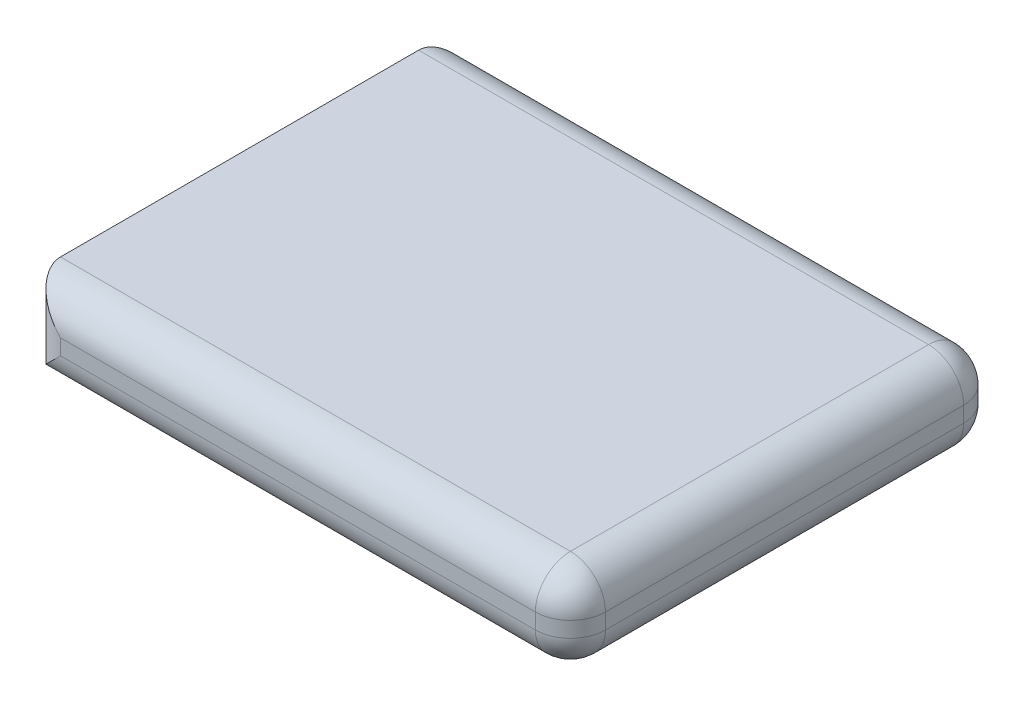
ISO-10303-21;
HEADER;
FILE_DESCRIPTION(('STEP AP214'),'2;1');
FILE_NAME('part.step','',(''),(''),'','','');
FILE_SCHEMA(('AUTOMOTIVE_DESIGN { 1 0 10303 214 1 1 1 1 }'));
ENDSEC;
DATA;
#1=APPLICATION_CONTEXT('core data for automotive mechanical design processes');
#2=APPLICATION_PROTOCOL_DEFINITION('international standard','automotive_design',2000,#1);
#3=PRODUCT_CONTEXT('',#1,'mechanical');
#4=PRODUCT('Part','Part','',(#3));
#5=PRODUCT_RELATED_PRODUCT_CATEGORY('part','',(#4));
#6=PRODUCT_DEFINITION_FORMATION('','',#4);
#7=PRODUCT_DEFINITION_CONTEXT('part definition',#1,'design');
#8=PRODUCT_DEFINITION('design','',#6,#7);
#9=PRODUCT_DEFINITION_SHAPE('','',#8);
#10=(LENGTH_UNIT() NAMED_UNIT(*) SI_UNIT(.MILLI.,.METRE.));
#11=(NAMED_UNIT(*) PLANE_ANGLE_UNIT() SI_UNIT($,.RADIAN.));
#12=(NAMED_UNIT(*) SI_UNIT($,.STERADIAN.) SOLID_ANGLE_UNIT());
#13=UNCERTAINTY_MEASURE_WITH_UNIT(LENGTH_MEASURE(1.E-05),#10,'distance_accuracy_value','');
#14=(GEOMETRIC_REPRESENTATION_CONTEXT(3) GLOBAL_UNCERTAINTY_ASSIGNED_CONTEXT((#13)) GLOBAL_UNIT_ASSIGNED_CONTEXT((#10,
#11,#12)) REPRESENTATION_CONTEXT('',''));
#15=CARTESIAN_POINT('',(0.,0.,0.));
#16=DIRECTION('',(0.,0.,1.));
#17=DIRECTION('',(1.,0.,0.));
#18=AXIS2_PLACEMENT_3D('',#15,#16,#17);
#19=CARTESIAN_POINT('',(35.,5.5,27.5));
#20=DIRECTION('',(-1.,0.,0.));
#21=DIRECTION('',(0.,0.,1.));
#22=AXIS2_PLACEMENT_3D('',#19,#20,#21);
#23=PLANE('',#22);
#24=DIRECTION('',(0.,-1.,0.));
#25=VECTOR('',#24,1.);
#26=CARTESIAN_POINT('',(35.,5.5,-23.));
#27=LINE('',#26,#25);
#28=CARTESIAN_POINT('',(35.,-1.,-23.));
#29=VERTEX_POINT('',#28);
#30=CARTESIAN_POINT('',(35.,1.,-23.));
#31=VERTEX_POINT('',#30);
#32=EDGE_CURVE('E168',#29,#31,#27,.F.);
#33=ORIENTED_EDGE('',*,*,#32,.T.);
#34=DIRECTION('',(0.,0.,-1.));
#35=VECTOR('',#34,1.);
#36=CARTESIAN_POINT('',(35.,1.,27.5));
#37=LINE('',#36,#35);
#38=CARTESIAN_POINT('',(35.,1.,23.));
#39=VERTEX_POINT('',#38);
#40=EDGE_CURVE('E170',#31,#39,#37,.F.);
#41=ORIENTED_EDGE('',*,*,#40,.T.);
#42=DIRECTION('',(0.,-1.,0.));
#43=VECTOR('',#42,1.);
#44=CARTESIAN_POINT('',(35.,5.5,23.));
#45=LINE('',#44,#43);
#46=CARTESIAN_POINT('',(35.,-1.,23.));
#47=VERTEX_POINT('',#46);
#48=EDGE_CURVE('E164',#39,#47,#45,.T.);
#49=ORIENTED_EDGE('',*,*,#48,.T.);
#50=DIRECTION('',(0.,0.,-1.));
#51=VECTOR('',#50,1.);
#52=CARTESIAN_POINT('',(35.,-1.,-27.5));
#53=LINE('',#52,#51);
#54=EDGE_CURVE('E166',#47,#29,#53,.T.);
#55=ORIENTED_EDGE('',*,*,#54,.T.);
#56=EDGE_LOOP('',(#33,#41,#49,#55));
#57=FACE_BOUND('',#56,.T.);
#58=ADVANCED_FACE('F33',(#57),#23,.F.);
#59=CARTESIAN_POINT('',(-35.,5.5,-27.5));
#60=DIRECTION('',(0.,0.,1.));
#61=DIRECTION('',(1.,0.,0.));
#62=AXIS2_PLACEMENT_3D('',#59,#60,#61);
#63=PLANE('',#62);
#64=DIRECTION('',(0.,-1.,0.));
#65=VECTOR('',#64,1.);
#66=CARTESIAN_POINT('',(-30.5,5.5,-27.5));
#67=LINE('',#66,#65);
#68=CARTESIAN_POINT('',(-30.5,-1.,-27.5));
#69=VERTEX_POINT('',#68);
#70=CARTESIAN_POINT('',(-30.5,1.,-27.5));
#71=VERTEX_POINT('',#70);
#72=EDGE_CURVE('E155',#69,#71,#67,.F.);
#73=ORIENTED_EDGE('',*,*,#72,.T.);
#74=DIRECTION('',(-1.,0.,0.));
#75=VECTOR('',#74,1.);
#76=CARTESIAN_POINT('',(-35.,1.,-27.5));
#77=LINE('',#76,#75);
#78=CARTESIAN_POINT('',(30.5,1.,-27.5));
#79=VERTEX_POINT('',#78);
#80=EDGE_CURVE('E116',#71,#79,#77,.F.);
#81=ORIENTED_EDGE('',*,*,#80,.T.);
#82=DIRECTION('',(0.,-1.,0.));
#83=VECTOR('',#82,1.);
#84=CARTESIAN_POINT('',(30.5,5.5,-27.5));
#85=LINE('',#84,#83);
#86=CARTESIAN_POINT('',(30.5,-1.,-27.5));
#87=VERTEX_POINT('',#86);
#88=EDGE_CURVE('E141',#79,#87,#85,.T.);
#89=ORIENTED_EDGE('',*,*,#88,.T.);
#90=DIRECTION('',(-1.,0.,0.));
#91=VECTOR('',#90,1.);
#92=CARTESIAN_POINT('',(-35.,-1.,-27.5));
#93=LINE('',#92,#91);
#94=EDGE_CURVE('E153',#87,#69,#93,.T.);
#95=ORIENTED_EDGE('',*,*,#94,.T.);
#96=EDGE_LOOP('',(#73,#81,#89,#95));
#97=FACE_BOUND('',#96,.T.);
#98=ADVANCED_FACE('F231',(#97),#63,.F.);
#99=CARTESIAN_POINT('',(-35.,5.5,27.5));
#100=DIRECTION('',(1.,0.,0.));
#101=DIRECTION('',(0.,0.,-1.));
#102=AXIS2_PLACEMENT_3D('',#99,#100,#101);
#103=PLANE('',#102);
#104=DIRECTION('',(0.,0.,1.));
#105=VECTOR('',#104,1.);
#106=CARTESIAN_POINT('',(-35.,5.5,27.5));
#107=LINE('',#106,#105);
#108=CARTESIAN_POINT('',(-35.,5.5,-23.));
#109=VERTEX_POINT('',#108);
#110=CARTESIAN_POINT('',(-35.,5.5,23.));
#111=VERTEX_POINT('',#110);
#112=EDGE_CURVE('E136',#109,#111,#107,.T.);
#113=ORIENTED_EDGE('',*,*,#112,.F.);
#114=DIRECTION('',(0.,-1.,0.));
#115=VECTOR('',#114,1.);
#116=CARTESIAN_POINT('',(-35.,5.5,-23.));
#117=LINE('',#116,#115);
#118=CARTESIAN_POINT('',(-35.,-5.5,-23.));
#119=VERTEX_POINT('',#118);
#120=EDGE_CURVE('E122',#109,#119,#117,.T.);
#121=ORIENTED_EDGE('',*,*,#120,.T.);
#122=DIRECTION('',(0.,0.,1.));
#123=VECTOR('',#122,1.);
#124=CARTESIAN_POINT('',(-35.,-5.5,27.5));
#125=LINE('',#124,#123);
#126=CARTESIAN_POINT('',(-35.,-5.5,23.));
#127=VERTEX_POINT('',#126);
#128=EDGE_CURVE('E146',#119,#127,#125,.T.);
#129=ORIENTED_EDGE('',*,*,#128,.T.);
#130=DIRECTION('',(0.,-1.,0.));
#131=VECTOR('',#130,1.);
#132=CARTESIAN_POINT('',(-35.,5.5,23.));
#133=LINE('',#132,#131);
#134=EDGE_CURVE('E131',#127,#111,#133,.F.);
#135=ORIENTED_EDGE('',*,*,#134,.T.);
#136=EDGE_LOOP('',(#113,#121,#129,#135));
#137=FACE_BOUND('',#136,.T.);
#138=ADVANCED_FACE('F143',(#137),#103,.F.);
#139=CARTESIAN_POINT('',(-35.,5.5,27.5));
#140=DIRECTION('',(0.,0.,-1.));
#141=DIRECTION('',(-1.,0.,0.));
#142=AXIS2_PLACEMENT_3D('',#139,#140,#141);
#143=PLANE('',#142);
#144=DIRECTION('',(1.,0.,0.));
#145=VECTOR('',#144,1.);
#146=CARTESIAN_POINT('',(-35.,1.,27.5));
#147=LINE('',#146,#145);
#148=CARTESIAN_POINT('',(30.5,1.,27.5));
#149=VERTEX_POINT('',#148);
#150=CARTESIAN_POINT('',(-30.5,1.,27.5));
#151=VERTEX_POINT('',#150);
#152=EDGE_CURVE('E42',#149,#151,#147,.F.);
#153=ORIENTED_EDGE('',*,*,#152,.T.);
#154=DIRECTION('',(0.,-1.,0.));
#155=VECTOR('',#154,1.);
#156=CARTESIAN_POINT('',(-30.5,5.5,27.5));
#157=LINE('',#156,#155);
#158=CARTESIAN_POINT('',(-30.5,-1.,27.5));
#159=VERTEX_POINT('',#158);
#160=EDGE_CURVE('E11',#151,#159,#157,.T.);
#161=ORIENTED_EDGE('',*,*,#160,.T.);
#162=DIRECTION('',(1.,0.,0.));
#163=VECTOR('',#162,1.);
#164=CARTESIAN_POINT('',(35.,-1.,27.5));
#165=LINE('',#164,#163);
#166=CARTESIAN_POINT('',(30.5,-1.,27.5));
#167=VERTEX_POINT('',#166);
#168=EDGE_CURVE('E173',#159,#167,#165,.T.);
#169=ORIENTED_EDGE('',*,*,#168,.T.);
#170=DIRECTION('',(0.,-1.,0.));
#171=VECTOR('',#170,1.);
#172=CARTESIAN_POINT('',(30.5,5.5,27.5));
#173=LINE('',#172,#171);
#174=EDGE_CURVE('E53',#167,#149,#173,.F.);
#175=ORIENTED_EDGE('',*,*,#174,.T.);
#176=EDGE_LOOP('',(#153,#161,#169,#175));
#177=FACE_BOUND('',#176,.T.);
#178=ADVANCED_FACE('F222',(#177),#143,.F.);
#179=CARTESIAN_POINT('',(0.,5.5,0.));
#180=DIRECTION('',(0.,-1.,0.));
#181=DIRECTION('',(0.,0.,-1.));
#182=AXIS2_PLACEMENT_3D('',#179,#180,#181);
#183=PLANE('',#182);
#184=DIRECTION('',(0.,0.,-1.));
#185=VECTOR('',#184,1.);
#186=CARTESIAN_POINT('',(30.5,5.5,0.));
#187=LINE('',#186,#185);
#188=CARTESIAN_POINT('',(30.5,5.5,23.));
#189=VERTEX_POINT('',#188);
#190=CARTESIAN_POINT('',(30.5,5.5,-23.));
#191=VERTEX_POINT('',#190);
#192=EDGE_CURVE('E139',#189,#191,#187,.T.);
#193=ORIENTED_EDGE('',*,*,#192,.T.);
#194=DIRECTION('',(-1.,0.,0.));
#195=VECTOR('',#194,1.);
#196=CARTESIAN_POINT('',(0.,5.5,-23.));
#197=LINE('',#196,#195);
#198=EDGE_CURVE('E114',#191,#109,#197,.T.);
#199=ORIENTED_EDGE('',*,*,#198,.T.);
#200=ORIENTED_EDGE('',*,*,#112,.T.);
#201=DIRECTION('',(1.,0.,0.));
#202=VECTOR('',#201,1.);
#203=CARTESIAN_POINT('',(0.,5.5,23.));
#204=LINE('',#203,#202);
#205=EDGE_CURVE('E145',#111,#189,#204,.T.);
#206=ORIENTED_EDGE('',*,*,#205,.T.);
#207=EDGE_LOOP('',(#193,#199,#200,#206));
#208=FACE_BOUND('',#207,.T.);
#209=ADVANCED_FACE('F135',(#208),#183,.F.);
#210=CARTESIAN_POINT('',(0.,-5.5,0.));
#211=DIRECTION('',(0.,-1.,0.));
#212=DIRECTION('',(0.,0.,-1.));
#213=AXIS2_PLACEMENT_3D('',#210,#211,#212);
#214=PLANE('',#213);
#215=ORIENTED_EDGE('',*,*,#128,.F.);
#216=DIRECTION('',(-1.,0.,0.));
#217=VECTOR('',#216,1.);
#218=CARTESIAN_POINT('',(35.,-5.5,-23.));
#219=LINE('',#218,#217);
#220=CARTESIAN_POINT('',(30.5,-5.5,-23.));
#221=VERTEX_POINT('',#220);
#222=EDGE_CURVE('E162',#119,#221,#219,.F.);
#223=ORIENTED_EDGE('',*,*,#222,.T.);
#224=DIRECTION('',(0.,0.,-1.));
#225=VECTOR('',#224,1.);
#226=CARTESIAN_POINT('',(30.5,-5.5,27.5));
#227=LINE('',#226,#225);
#228=CARTESIAN_POINT('',(30.5,-5.5,23.));
#229=VERTEX_POINT('',#228);
#230=EDGE_CURVE('E160',#221,#229,#227,.F.);
#231=ORIENTED_EDGE('',*,*,#230,.T.);
#232=DIRECTION('',(1.,0.,0.));
#233=VECTOR('',#232,1.);
#234=CARTESIAN_POINT('',(-35.,-5.5,23.));
#235=LINE('',#234,#233);
#236=EDGE_CURVE('E130',#229,#127,#235,.F.);
#237=ORIENTED_EDGE('',*,*,#236,.T.);
#238=EDGE_LOOP('',(#215,#223,#231,#237));
#239=FACE_BOUND('',#238,.T.);
#240=ADVANCED_FACE('F229',(#239),#214,.T.);
#241=CARTESIAN_POINT('',(-35.,-1.,23.));
#242=DIRECTION('',(-1.,0.,0.));
#243=DIRECTION('',(0.,0.,1.));
#244=AXIS2_PLACEMENT_3D('',#241,#242,#243);
#245=CYLINDRICAL_SURFACE('',#244,4.5);
#246=CARTESIAN_POINT('',(30.5,-1.,23.));
#247=DIRECTION('',(1.,0.,0.));
#248=DIRECTION('',(0.,0.,-1.));
#249=AXIS2_PLACEMENT_3D('',#246,#247,#248);
#250=CIRCLE('',#249,4.5);
#251=EDGE_CURVE('E210',#167,#229,#250,.T.);
#252=ORIENTED_EDGE('',*,*,#251,.F.);
#253=ORIENTED_EDGE('',*,*,#168,.F.);
#254=CARTESIAN_POINT('',(-30.5,-1.,23.));
#255=DIRECTION('',(-0.707106781186547,0.707106781186547,0.));
#256=DIRECTION('',(-0.707106781186547,-0.707106781186547,0.));
#257=AXIS2_PLACEMENT_3D('',#254,#255,#256);
#258=ELLIPSE('',#257,6.36396103067893,4.5);
#259=EDGE_CURVE('E37',#127,#159,#258,.T.);
#260=ORIENTED_EDGE('',*,*,#259,.F.);
#261=ORIENTED_EDGE('',*,*,#236,.F.);
#262=EDGE_LOOP('',(#252,#253,#260,#261));
#263=FACE_BOUND('',#262,.T.);
#264=ADVANCED_FACE('F35',(#263),#245,.T.);
#265=CARTESIAN_POINT('',(-30.5,5.5,23.));
#266=DIRECTION('',(0.,-1.,0.));
#267=DIRECTION('',(0.,0.,-1.));
#268=AXIS2_PLACEMENT_3D('',#265,#266,#267);
#269=CYLINDRICAL_SURFACE('',#268,4.5);
#270=ORIENTED_EDGE('',*,*,#259,.T.);
#271=ORIENTED_EDGE('',*,*,#160,.F.);
#272=CARTESIAN_POINT('',(-30.5,1.,23.));
#273=DIRECTION('',(0.707106781186547,0.707106781186547,0.));
#274=DIRECTION('',(0.707106781186547,-0.707106781186547,0.));
#275=AXIS2_PLACEMENT_3D('',#272,#273,#274);
#276=ELLIPSE('',#275,6.36396103067893,4.5);
#277=EDGE_CURVE('E205',#111,#151,#276,.T.);
#278=ORIENTED_EDGE('',*,*,#277,.F.);
#279=ORIENTED_EDGE('',*,*,#134,.F.);
#280=EDGE_LOOP('',(#270,#271,#278,#279));
#281=FACE_BOUND('',#280,.T.);
#282=ADVANCED_FACE('F219',(#281),#269,.T.);
#283=CARTESIAN_POINT('',(30.5,-1.,23.));
#284=DIRECTION('',(0.,0.,1.));
#285=DIRECTION('',(1.,0.,0.));
#286=AXIS2_PLACEMENT_3D('',#283,#284,#285);
#287=SPHERICAL_SURFACE('',#286,4.5);
#288=CARTESIAN_POINT('',(30.5,-1.,23.));
#289=DIRECTION('',(0.,0.,1.));
#290=DIRECTION('',(1.,0.,0.));
#291=AXIS2_PLACEMENT_3D('',#288,#289,#290);
#292=CIRCLE('',#291,4.5);
#293=EDGE_CURVE('E202',#47,#229,#292,.F.);
#294=ORIENTED_EDGE('',*,*,#293,.F.);
#295=CARTESIAN_POINT('',(30.5,-1.,23.));
#296=DIRECTION('',(0.,-1.,0.));
#297=DIRECTION('',(0.,0.,-1.));
#298=AXIS2_PLACEMENT_3D('',#295,#296,#297);
#299=CIRCLE('',#298,4.5);
#300=EDGE_CURVE('E208',#167,#47,#299,.F.);
#301=ORIENTED_EDGE('',*,*,#300,.F.);
#302=ORIENTED_EDGE('',*,*,#251,.T.);
#303=EDGE_LOOP('',(#294,#301,#302));
#304=FACE_BOUND('',#303,.T.);
#305=ADVANCED_FACE('F282',(#304),#287,.T.);
#306=CARTESIAN_POINT('',(30.5,5.5,23.));
#307=DIRECTION('',(0.,-1.,0.));
#308=DIRECTION('',(0.,0.,-1.));
#309=AXIS2_PLACEMENT_3D('',#306,#307,#308);
#310=CYLINDRICAL_SURFACE('',#309,4.5);
#311=ORIENTED_EDGE('',*,*,#300,.T.);
#312=ORIENTED_EDGE('',*,*,#48,.F.);
#313=CARTESIAN_POINT('',(30.5,1.,23.));
#314=DIRECTION('',(0.,1.,0.));
#315=DIRECTION('',(0.,0.,1.));
#316=AXIS2_PLACEMENT_3D('',#313,#314,#315);
#317=CIRCLE('',#316,4.5);
#318=EDGE_CURVE('E199',#149,#39,#317,.T.);
#319=ORIENTED_EDGE('',*,*,#318,.F.);
#320=ORIENTED_EDGE('',*,*,#174,.F.);
#321=EDGE_LOOP('',(#311,#312,#319,#320));
#322=FACE_BOUND('',#321,.T.);
#323=ADVANCED_FACE('F278',(#322),#310,.T.);
#324=CARTESIAN_POINT('',(0.,1.,23.));
#325=DIRECTION('',(1.,0.,0.));
#326=DIRECTION('',(0.,0.,-1.));
#327=AXIS2_PLACEMENT_3D('',#324,#325,#326);
#328=CYLINDRICAL_SURFACE('',#327,4.5);
#329=ORIENTED_EDGE('',*,*,#277,.T.);
#330=ORIENTED_EDGE('',*,*,#152,.F.);
#331=CARTESIAN_POINT('',(30.5,1.,23.));
#332=DIRECTION('',(1.,0.,0.));
#333=DIRECTION('',(0.,0.,-1.));
#334=AXIS2_PLACEMENT_3D('',#331,#332,#333);
#335=CIRCLE('',#334,4.5);
#336=EDGE_CURVE('E196',#189,#149,#335,.T.);
#337=ORIENTED_EDGE('',*,*,#336,.F.);
#338=ORIENTED_EDGE('',*,*,#205,.F.);
#339=EDGE_LOOP('',(#329,#330,#337,#338));
#340=FACE_BOUND('',#339,.T.);
#341=ADVANCED_FACE('F274',(#340),#328,.T.);
#342=CARTESIAN_POINT('',(30.5,-1.,27.5));
#343=DIRECTION('',(0.,0.,1.));
#344=DIRECTION('',(1.,0.,0.));
#345=AXIS2_PLACEMENT_3D('',#342,#343,#344);
#346=CYLINDRICAL_SURFACE('',#345,4.5);
#347=ORIENTED_EDGE('',*,*,#293,.T.);
#348=ORIENTED_EDGE('',*,*,#230,.F.);
#349=CARTESIAN_POINT('',(30.5,-1.,-23.));
#350=DIRECTION('',(0.,0.,-1.));
#351=DIRECTION('',(-1.,0.,0.));
#352=AXIS2_PLACEMENT_3D('',#349,#350,#351);
#353=CIRCLE('',#352,4.5);
#354=EDGE_CURVE('E193',#29,#221,#353,.T.);
#355=ORIENTED_EDGE('',*,*,#354,.F.);
#356=ORIENTED_EDGE('',*,*,#54,.F.);
#357=EDGE_LOOP('',(#347,#348,#355,#356));
#358=FACE_BOUND('',#357,.T.);
#359=ADVANCED_FACE('F270',(#358),#346,.T.);
#360=CARTESIAN_POINT('',(30.5,1.,23.));
#361=DIRECTION('',(0.,0.,1.));
#362=DIRECTION('',(1.,0.,0.));
#363=AXIS2_PLACEMENT_3D('',#360,#361,#362);
#364=SPHERICAL_SURFACE('',#363,4.5);
#365=ORIENTED_EDGE('',*,*,#336,.T.);
#366=ORIENTED_EDGE('',*,*,#318,.T.);
#367=CARTESIAN_POINT('',(30.5,1.,23.));
#368=DIRECTION('',(0.,0.,1.));
#369=DIRECTION('',(1.,0.,0.));
#370=AXIS2_PLACEMENT_3D('',#367,#368,#369);
#371=CIRCLE('',#370,4.5);
#372=EDGE_CURVE('E188',#189,#39,#371,.F.);
#373=ORIENTED_EDGE('',*,*,#372,.F.);
#374=EDGE_LOOP('',(#365,#366,#373));
#375=FACE_BOUND('',#374,.T.);
#376=ADVANCED_FACE('F266',(#375),#364,.T.);
#377=CARTESIAN_POINT('',(30.5,-1.,-23.));
#378=DIRECTION('',(0.,0.,1.));
#379=DIRECTION('',(1.,0.,0.));
#380=AXIS2_PLACEMENT_3D('',#377,#378,#379);
#381=SPHERICAL_SURFACE('',#380,4.5);
#382=CARTESIAN_POINT('',(30.5,-1.,-23.));
#383=DIRECTION('',(1.,0.,0.));
#384=DIRECTION('',(0.,0.,-1.));
#385=AXIS2_PLACEMENT_3D('',#382,#383,#384);
#386=CIRCLE('',#385,4.5);
#387=EDGE_CURVE('E185',#87,#221,#386,.F.);
#388=ORIENTED_EDGE('',*,*,#387,.F.);
#389=CARTESIAN_POINT('',(30.5,-1.,-23.));
#390=DIRECTION('',(0.,-1.,0.));
#391=DIRECTION('',(0.,0.,-1.));
#392=AXIS2_PLACEMENT_3D('',#389,#390,#391);
#393=CIRCLE('',#392,4.5);
#394=EDGE_CURVE('E190',#29,#87,#393,.F.);
#395=ORIENTED_EDGE('',*,*,#394,.F.);
#396=ORIENTED_EDGE('',*,*,#354,.T.);
#397=EDGE_LOOP('',(#388,#395,#396));
#398=FACE_BOUND('',#397,.T.);
#399=ADVANCED_FACE('F262',(#398),#381,.T.);
#400=CARTESIAN_POINT('',(30.5,5.5,-23.));
#401=DIRECTION('',(0.,-1.,0.));
#402=DIRECTION('',(0.,0.,-1.));
#403=AXIS2_PLACEMENT_3D('',#400,#401,#402);
#404=CYLINDRICAL_SURFACE('',#403,4.5);
#405=ORIENTED_EDGE('',*,*,#394,.T.);
#406=ORIENTED_EDGE('',*,*,#88,.F.);
#407=CARTESIAN_POINT('',(30.5,1.,-23.));
#408=DIRECTION('',(0.,1.,0.));
#409=DIRECTION('',(0.,0.,1.));
#410=AXIS2_PLACEMENT_3D('',#407,#408,#409);
#411=CIRCLE('',#410,4.5);
#412=EDGE_CURVE('E182',#31,#79,#411,.T.);
#413=ORIENTED_EDGE('',*,*,#412,.F.);
#414=ORIENTED_EDGE('',*,*,#32,.F.);
#415=EDGE_LOOP('',(#405,#406,#413,#414));
#416=FACE_BOUND('',#415,.T.);
#417=ADVANCED_FACE('F258',(#416),#404,.T.);
#418=CARTESIAN_POINT('',(30.5,1.,0.));
#419=DIRECTION('',(0.,0.,-1.));
#420=DIRECTION('',(-1.,0.,0.));
#421=AXIS2_PLACEMENT_3D('',#418,#419,#420);
#422=CYLINDRICAL_SURFACE('',#421,4.5);
#423=ORIENTED_EDGE('',*,*,#372,.T.);
#424=ORIENTED_EDGE('',*,*,#40,.F.);
#425=CARTESIAN_POINT('',(30.5,1.,-23.));
#426=DIRECTION('',(0.,0.,-1.));
#427=DIRECTION('',(-1.,0.,0.));
#428=AXIS2_PLACEMENT_3D('',#425,#426,#427);
#429=CIRCLE('',#428,4.5);
#430=EDGE_CURVE('E179',#191,#31,#429,.T.);
#431=ORIENTED_EDGE('',*,*,#430,.F.);
#432=ORIENTED_EDGE('',*,*,#192,.F.);
#433=EDGE_LOOP('',(#423,#424,#431,#432));
#434=FACE_BOUND('',#433,.T.);
#435=ADVANCED_FACE('F254',(#434),#422,.T.);
#436=CARTESIAN_POINT('',(-35.,-1.,-23.));
#437=DIRECTION('',(1.,0.,0.));
#438=DIRECTION('',(0.,0.,-1.));
#439=AXIS2_PLACEMENT_3D('',#436,#437,#438);
#440=CYLINDRICAL_SURFACE('',#439,4.5);
#441=ORIENTED_EDGE('',*,*,#387,.T.);
#442=ORIENTED_EDGE('',*,*,#222,.F.);
#443=CARTESIAN_POINT('',(-30.5,-1.,-23.));
#444=DIRECTION('',(0.707106781186547,-0.707106781186547,0.));
#445=DIRECTION('',(0.707106781186547,0.707106781186547,0.));
#446=AXIS2_PLACEMENT_3D('',#443,#444,#445);
#447=ELLIPSE('',#446,6.36396103067893,4.5);
#448=EDGE_CURVE('E125',#69,#119,#447,.F.);
#449=ORIENTED_EDGE('',*,*,#448,.F.);
#450=ORIENTED_EDGE('',*,*,#94,.F.);
#451=EDGE_LOOP('',(#441,#442,#449,#450));
#452=FACE_BOUND('',#451,.T.);
#453=ADVANCED_FACE('F250',(#452),#440,.T.);
#454=CARTESIAN_POINT('',(30.5,1.,-23.));
#455=DIRECTION('',(0.,0.,1.));
#456=DIRECTION('',(1.,0.,0.));
#457=AXIS2_PLACEMENT_3D('',#454,#455,#456);
#458=SPHERICAL_SURFACE('',#457,4.5);
#459=ORIENTED_EDGE('',*,*,#430,.T.);
#460=ORIENTED_EDGE('',*,*,#412,.T.);
#461=CARTESIAN_POINT('',(30.5,1.,-23.));
#462=DIRECTION('',(1.,0.,0.));
#463=DIRECTION('',(0.,1.,0.));
#464=AXIS2_PLACEMENT_3D('',#461,#462,#463);
#465=CIRCLE('',#464,4.5);
#466=EDGE_CURVE('E119',#191,#79,#465,.F.);
#467=ORIENTED_EDGE('',*,*,#466,.F.);
#468=EDGE_LOOP('',(#459,#460,#467));
#469=FACE_BOUND('',#468,.T.);
#470=ADVANCED_FACE('F247',(#469),#458,.T.);
#471=CARTESIAN_POINT('',(-30.5,5.5,-23.));
#472=DIRECTION('',(0.,-1.,0.));
#473=DIRECTION('',(0.,0.,-1.));
#474=AXIS2_PLACEMENT_3D('',#471,#472,#473);
#475=CYLINDRICAL_SURFACE('',#474,4.5);
#476=ORIENTED_EDGE('',*,*,#448,.T.);
#477=ORIENTED_EDGE('',*,*,#120,.F.);
#478=CARTESIAN_POINT('',(-30.5,1.,-23.));
#479=DIRECTION('',(-0.707106781186547,-0.707106781186547,0.));
#480=DIRECTION('',(0.707106781186547,-0.707106781186547,0.));
#481=AXIS2_PLACEMENT_3D('',#478,#479,#480);
#482=ELLIPSE('',#481,6.36396103067893,4.5);
#483=EDGE_CURVE('E110',#71,#109,#482,.F.);
#484=ORIENTED_EDGE('',*,*,#483,.F.);
#485=ORIENTED_EDGE('',*,*,#72,.F.);
#486=EDGE_LOOP('',(#476,#477,#484,#485));
#487=FACE_BOUND('',#486,.T.);
#488=ADVANCED_FACE('F123',(#487),#475,.T.);
#489=CARTESIAN_POINT('',(0.,1.,-23.));
#490=DIRECTION('',(-1.,0.,0.));
#491=DIRECTION('',(0.,0.,1.));
#492=AXIS2_PLACEMENT_3D('',#489,#490,#491);
#493=CYLINDRICAL_SURFACE('',#492,4.5);
#494=ORIENTED_EDGE('',*,*,#466,.T.);
#495=ORIENTED_EDGE('',*,*,#80,.F.);
#496=ORIENTED_EDGE('',*,*,#483,.T.);
#497=ORIENTED_EDGE('',*,*,#198,.F.);
#498=EDGE_LOOP('',(#494,#495,#496,#497));
#499=FACE_BOUND('',#498,.T.);
#500=ADVANCED_FACE('F112',(#499),#493,.T.);
#501=CLOSED_SHELL('',(#58,#98,#138,#178,#209,#240,#264,#282,#305,#323,#341,#359,#376,#399,#417,
#435,#453,#470,#488,#500));
#502=MANIFOLD_SOLID_BREP('B2',#501);
#503=ADVANCED_BREP_SHAPE_REPRESENTATION('',(#18,#502),#14);
#504=SHAPE_DEFINITION_REPRESENTATION(#9,#503);
ENDSEC;
END-ISO-10303-21;
